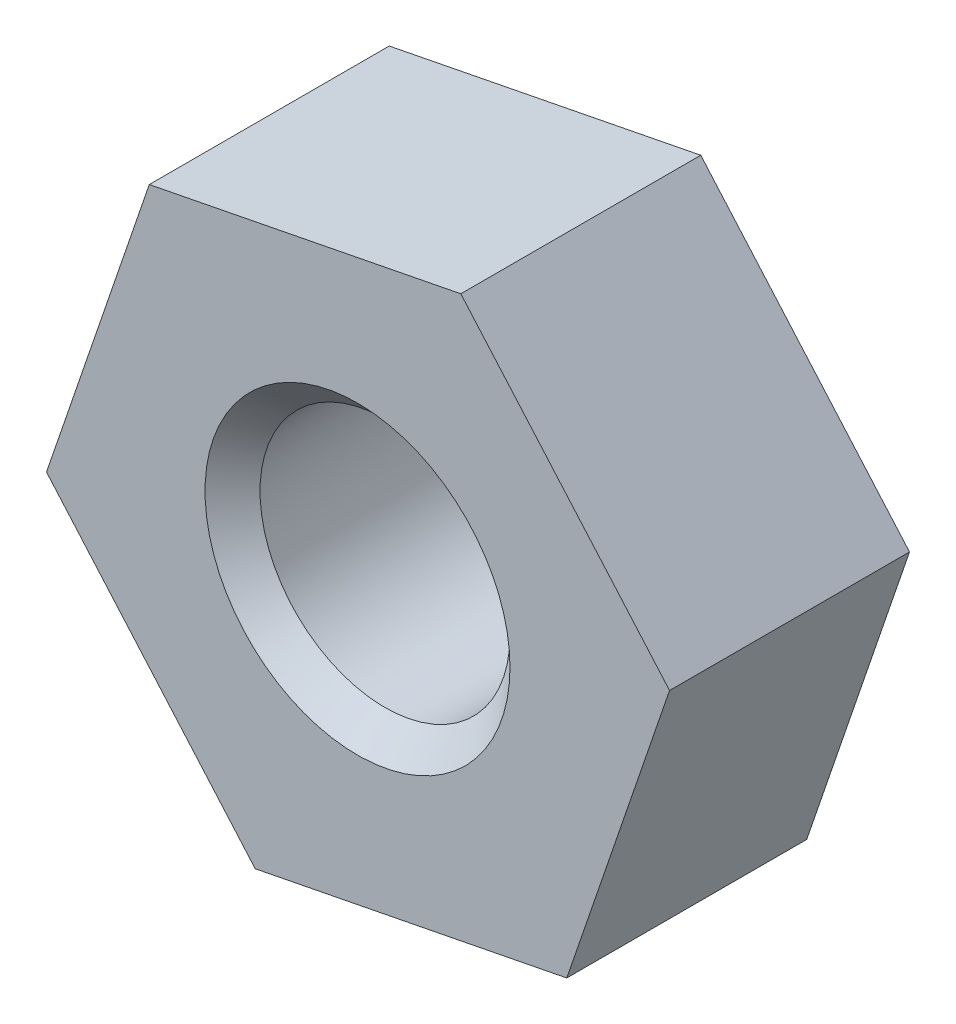
ISO-10303-21;
HEADER;
FILE_DESCRIPTION(('STEP AP214'),'2;1');
FILE_NAME('part.step','',(''),(''),'','','');
FILE_SCHEMA(('AUTOMOTIVE_DESIGN { 1 0 10303 214 1 1 1 1 }'));
ENDSEC;
DATA;
#1=APPLICATION_CONTEXT('core data for automotive mechanical design processes');
#2=APPLICATION_PROTOCOL_DEFINITION('international standard','automotive_design',2000,#1);
#3=PRODUCT_CONTEXT('',#1,'mechanical');
#4=PRODUCT('Part','Part','',(#3));
#5=PRODUCT_RELATED_PRODUCT_CATEGORY('part','',(#4));
#6=PRODUCT_DEFINITION_FORMATION('','',#4);
#7=PRODUCT_DEFINITION_CONTEXT('part definition',#1,'design');
#8=PRODUCT_DEFINITION('design','',#6,#7);
#9=PRODUCT_DEFINITION_SHAPE('','',#8);
#10=(LENGTH_UNIT() NAMED_UNIT(*) SI_UNIT(.MILLI.,.METRE.));
#11=(NAMED_UNIT(*) PLANE_ANGLE_UNIT() SI_UNIT($,.RADIAN.));
#12=(NAMED_UNIT(*) SI_UNIT($,.STERADIAN.) SOLID_ANGLE_UNIT());
#13=UNCERTAINTY_MEASURE_WITH_UNIT(LENGTH_MEASURE(1.E-05),#10,'distance_accuracy_value','');
#14=(GEOMETRIC_REPRESENTATION_CONTEXT(3) GLOBAL_UNCERTAINTY_ASSIGNED_CONTEXT((#13)) GLOBAL_UNIT_ASSIGNED_CONTEXT((#10,
#11,#12)) REPRESENTATION_CONTEXT('',''));
#15=CARTESIAN_POINT('',(0.,0.,0.));
#16=DIRECTION('',(0.,0.,1.));
#17=DIRECTION('',(1.,0.,0.));
#18=AXIS2_PLACEMENT_3D('',#15,#16,#17);
#19=CARTESIAN_POINT('',(-1.02811005333173,-3.00438397206009,2.4));
#20=DIRECTION('',(-0.192674138641678,0.981262796756652,0.));
#21=DIRECTION('',(-0.981262796756653,-0.192674138641678,0.));
#22=AXIS2_PLACEMENT_3D('',#19,#20,#21);
#23=PLANE('',#22);
#24=DIRECTION('',(0.981262796756653,0.192674138641678,0.));
#25=VECTOR('',#24,1.);
#26=CARTESIAN_POINT('',(-1.02811005333173,-3.00438397206009,0.));
#27=LINE('',#26,#25);
#28=CARTESIAN_POINT('',(-1.02811005333173,-3.00438397206009,0.));
#29=VERTEX_POINT('',#28);
#30=CARTESIAN_POINT('',(2.08781781586096,-2.3925614101015,0.));
#31=VERTEX_POINT('',#30);
#32=EDGE_CURVE('E138',#29,#31,#27,.T.);
#33=ORIENTED_EDGE('',*,*,#32,.T.);
#34=DIRECTION('',(0.,0.,-1.));
#35=VECTOR('',#34,1.);
#36=CARTESIAN_POINT('',(2.08781781586096,-2.3925614101015,2.4));
#37=LINE('',#36,#35);
#38=CARTESIAN_POINT('',(2.08781781586096,-2.3925614101015,2.4));
#39=VERTEX_POINT('',#38);
#40=EDGE_CURVE('E11',#39,#31,#37,.T.);
#41=ORIENTED_EDGE('',*,*,#40,.F.);
#42=DIRECTION('',(0.981262796756653,0.192674138641678,0.));
#43=VECTOR('',#42,1.);
#44=CARTESIAN_POINT('',(-1.02811005333173,-3.00438397206009,2.4));
#45=LINE('',#44,#43);
#46=CARTESIAN_POINT('',(-1.02811005333173,-3.00438397206009,2.4));
#47=VERTEX_POINT('',#46);
#48=EDGE_CURVE('E155',#47,#39,#45,.T.);
#49=ORIENTED_EDGE('',*,*,#48,.F.);
#50=DIRECTION('',(0.,0.,-1.));
#51=VECTOR('',#50,1.);
#52=CARTESIAN_POINT('',(-1.02811005333173,-3.00438397206009,2.4));
#53=LINE('',#52,#51);
#54=EDGE_CURVE('E134',#47,#29,#53,.T.);
#55=ORIENTED_EDGE('',*,*,#54,.T.);
#56=EDGE_LOOP('',(#33,#41,#49,#55));
#57=FACE_BOUND('',#56,.T.);
#58=ADVANCED_FACE('F49',(#57),#23,.F.);
#59=CARTESIAN_POINT('',(2.08781781586096,-2.3925614101015,2.4));
#60=DIRECTION('',(-0.946135579100666,0.323770699662348,0.));
#61=DIRECTION('',(-0.323770699662348,-0.946135579100666,0.));
#62=AXIS2_PLACEMENT_3D('',#59,#60,#61);
#63=PLANE('',#62);
#64=DIRECTION('',(0.323770699662348,0.946135579100666,0.));
#65=VECTOR('',#64,1.);
#66=CARTESIAN_POINT('',(2.08781781586096,-2.3925614101015,0.));
#67=LINE('',#66,#65);
#68=CARTESIAN_POINT('',(3.1159278691927,0.611822561958587,0.));
#69=VERTEX_POINT('',#68);
#70=EDGE_CURVE('E142',#31,#69,#67,.T.);
#71=ORIENTED_EDGE('',*,*,#70,.T.);
#72=DIRECTION('',(0.,0.,-1.));
#73=VECTOR('',#72,1.);
#74=CARTESIAN_POINT('',(3.1159278691927,0.611822561958587,2.4));
#75=LINE('',#74,#73);
#76=CARTESIAN_POINT('',(3.1159278691927,0.611822561958587,2.4));
#77=VERTEX_POINT('',#76);
#78=EDGE_CURVE('E58',#77,#69,#75,.T.);
#79=ORIENTED_EDGE('',*,*,#78,.F.);
#80=DIRECTION('',(0.323770699662348,0.946135579100666,0.));
#81=VECTOR('',#80,1.);
#82=CARTESIAN_POINT('',(2.08781781586096,-2.3925614101015,2.4));
#83=LINE('',#82,#81);
#84=EDGE_CURVE('E103',#39,#77,#83,.T.);
#85=ORIENTED_EDGE('',*,*,#84,.F.);
#86=ORIENTED_EDGE('',*,*,#40,.T.);
#87=EDGE_LOOP('',(#71,#79,#85,#86));
#88=FACE_BOUND('',#87,.T.);
#89=ADVANCED_FACE('F184',(#88),#63,.F.);
#90=CARTESIAN_POINT('',(3.1159278691927,0.611822561958587,2.4));
#91=DIRECTION('',(-0.753461440458988,-0.657492097094305,0.));
#92=DIRECTION('',(0.657492097094305,-0.753461440458988,0.));
#93=AXIS2_PLACEMENT_3D('',#90,#91,#92);
#94=PLANE('',#93);
#95=DIRECTION('',(-0.657492097094305,0.753461440458988,0.));
#96=VECTOR('',#95,1.);
#97=CARTESIAN_POINT('',(3.1159278691927,0.611822561958587,0.));
#98=LINE('',#97,#96);
#99=CARTESIAN_POINT('',(1.02811005333174,3.00438397206009,0.));
#100=VERTEX_POINT('',#99);
#101=EDGE_CURVE('E146',#69,#100,#98,.T.);
#102=ORIENTED_EDGE('',*,*,#101,.T.);
#103=DIRECTION('',(0.,0.,-1.));
#104=VECTOR('',#103,1.);
#105=CARTESIAN_POINT('',(1.02811005333174,3.00438397206009,2.4));
#106=LINE('',#105,#104);
#107=CARTESIAN_POINT('',(1.02811005333174,3.00438397206009,2.4));
#108=VERTEX_POINT('',#107);
#109=EDGE_CURVE('E127',#108,#100,#106,.T.);
#110=ORIENTED_EDGE('',*,*,#109,.F.);
#111=DIRECTION('',(-0.657492097094305,0.753461440458988,0.));
#112=VECTOR('',#111,1.);
#113=CARTESIAN_POINT('',(3.1159278691927,0.611822561958587,2.4));
#114=LINE('',#113,#112);
#115=EDGE_CURVE('E116',#77,#108,#114,.T.);
#116=ORIENTED_EDGE('',*,*,#115,.F.);
#117=ORIENTED_EDGE('',*,*,#78,.T.);
#118=EDGE_LOOP('',(#102,#110,#116,#117));
#119=FACE_BOUND('',#118,.T.);
#120=ADVANCED_FACE('F165',(#119),#94,.F.);
#121=CARTESIAN_POINT('',(1.02811005333174,3.00438397206009,2.4));
#122=DIRECTION('',(0.192674138641678,-0.981262796756652,0.));
#123=DIRECTION('',(0.981262796756653,0.192674138641678,0.));
#124=AXIS2_PLACEMENT_3D('',#121,#122,#123);
#125=PLANE('',#124);
#126=DIRECTION('',(-0.981262796756653,-0.192674138641678,0.));
#127=VECTOR('',#126,1.);
#128=CARTESIAN_POINT('',(1.02811005333174,3.00438397206009,0.));
#129=LINE('',#128,#127);
#130=CARTESIAN_POINT('',(-2.08781781586096,2.3925614101015,0.));
#131=VERTEX_POINT('',#130);
#132=EDGE_CURVE('E125',#100,#131,#129,.T.);
#133=ORIENTED_EDGE('',*,*,#132,.T.);
#134=DIRECTION('',(0.,0.,-1.));
#135=VECTOR('',#134,1.);
#136=CARTESIAN_POINT('',(-2.08781781586096,2.3925614101015,2.4));
#137=LINE('',#136,#135);
#138=CARTESIAN_POINT('',(-2.08781781586096,2.3925614101015,2.4));
#139=VERTEX_POINT('',#138);
#140=EDGE_CURVE('E122',#139,#131,#137,.T.);
#141=ORIENTED_EDGE('',*,*,#140,.F.);
#142=DIRECTION('',(-0.981262796756653,-0.192674138641678,0.));
#143=VECTOR('',#142,1.);
#144=CARTESIAN_POINT('',(1.02811005333174,3.00438397206009,2.4));
#145=LINE('',#144,#143);
#146=EDGE_CURVE('E110',#108,#139,#145,.T.);
#147=ORIENTED_EDGE('',*,*,#146,.F.);
#148=ORIENTED_EDGE('',*,*,#109,.T.);
#149=EDGE_LOOP('',(#133,#141,#147,#148));
#150=FACE_BOUND('',#149,.T.);
#151=ADVANCED_FACE('F123',(#150),#125,.F.);
#152=CARTESIAN_POINT('',(-2.08781781586096,2.3925614101015,2.4));
#153=DIRECTION('',(0.946135579100667,-0.323770699662348,0.));
#154=DIRECTION('',(0.323770699662348,0.946135579100667,0.));
#155=AXIS2_PLACEMENT_3D('',#152,#153,#154);
#156=PLANE('',#155);
#157=DIRECTION('',(-0.323770699662348,-0.946135579100666,0.));
#158=VECTOR('',#157,1.);
#159=CARTESIAN_POINT('',(-2.08781781586096,2.3925614101015,0.));
#160=LINE('',#159,#158);
#161=CARTESIAN_POINT('',(-3.1159278691927,-0.611822561958588,0.));
#162=VERTEX_POINT('',#161);
#163=EDGE_CURVE('E89',#131,#162,#160,.T.);
#164=ORIENTED_EDGE('',*,*,#163,.T.);
#165=DIRECTION('',(0.,0.,-1.));
#166=VECTOR('',#165,1.);
#167=CARTESIAN_POINT('',(-3.1159278691927,-0.611822561958588,2.4));
#168=LINE('',#167,#166);
#169=CARTESIAN_POINT('',(-3.1159278691927,-0.611822561958588,2.4));
#170=VERTEX_POINT('',#169);
#171=EDGE_CURVE('E128',#170,#162,#168,.T.);
#172=ORIENTED_EDGE('',*,*,#171,.F.);
#173=DIRECTION('',(-0.323770699662348,-0.946135579100666,0.));
#174=VECTOR('',#173,1.);
#175=CARTESIAN_POINT('',(-2.08781781586096,2.3925614101015,2.4));
#176=LINE('',#175,#174);
#177=EDGE_CURVE('E114',#139,#170,#176,.T.);
#178=ORIENTED_EDGE('',*,*,#177,.F.);
#179=ORIENTED_EDGE('',*,*,#140,.T.);
#180=EDGE_LOOP('',(#164,#172,#178,#179));
#181=FACE_BOUND('',#180,.T.);
#182=ADVANCED_FACE('F130',(#181),#156,.F.);
#183=CARTESIAN_POINT('',(-3.1159278691927,-0.611822561958588,2.4));
#184=DIRECTION('',(0.753461440458988,0.657492097094305,0.));
#185=DIRECTION('',(-0.657492097094305,0.753461440458988,0.));
#186=AXIS2_PLACEMENT_3D('',#183,#184,#185);
#187=PLANE('',#186);
#188=DIRECTION('',(0.657492097094305,-0.753461440458988,0.));
#189=VECTOR('',#188,1.);
#190=CARTESIAN_POINT('',(-3.1159278691927,-0.611822561958588,0.));
#191=LINE('',#190,#189);
#192=EDGE_CURVE('E95',#162,#29,#191,.T.);
#193=ORIENTED_EDGE('',*,*,#192,.T.);
#194=ORIENTED_EDGE('',*,*,#54,.F.);
#195=DIRECTION('',(0.657492097094305,-0.753461440458988,0.));
#196=VECTOR('',#195,1.);
#197=CARTESIAN_POINT('',(-3.1159278691927,-0.611822561958588,2.4));
#198=LINE('',#197,#196);
#199=EDGE_CURVE('E66',#170,#47,#198,.T.);
#200=ORIENTED_EDGE('',*,*,#199,.F.);
#201=ORIENTED_EDGE('',*,*,#171,.T.);
#202=EDGE_LOOP('',(#193,#194,#200,#201));
#203=FACE_BOUND('',#202,.T.);
#204=ADVANCED_FACE('F172',(#203),#187,.F.);
#205=CARTESIAN_POINT('',(0.,0.,2.4));
#206=DIRECTION('',(0.,0.,1.));
#207=DIRECTION('',(1.,0.,0.));
#208=AXIS2_PLACEMENT_3D('',#205,#206,#207);
#209=PLANE('',#208);
#210=CARTESIAN_POINT('',(-0.005030104155474,0.0161290159713307,2.4));
#211=DIRECTION('',(0.,0.,1.));
#212=DIRECTION('',(1.,0.,0.));
#213=AXIS2_PLACEMENT_3D('',#210,#211,#212);
#214=CIRCLE('',#213,1.525);
#215=CARTESIAN_POINT('',(1.51996989584453,0.0161290159713307,2.4));
#216=VERTEX_POINT('',#215);
#217=EDGE_CURVE('E257',#216,#216,#214,.T.);
#218=ORIENTED_EDGE('',*,*,#217,.F.);
#219=EDGE_LOOP('',(#218));
#220=FACE_BOUND('',#219,.T.);
#221=ORIENTED_EDGE('',*,*,#48,.T.);
#222=ORIENTED_EDGE('',*,*,#84,.T.);
#223=ORIENTED_EDGE('',*,*,#115,.T.);
#224=ORIENTED_EDGE('',*,*,#146,.T.);
#225=ORIENTED_EDGE('',*,*,#177,.T.);
#226=ORIENTED_EDGE('',*,*,#199,.T.);
#227=EDGE_LOOP('',(#221,#222,#223,#224,#225,#226));
#228=FACE_BOUND('',#227,.T.);
#229=ADVANCED_FACE('F112',(#220,#228),#209,.T.);
#230=CARTESIAN_POINT('',(0.,0.,0.));
#231=DIRECTION('',(0.,0.,1.));
#232=DIRECTION('',(1.,0.,0.));
#233=AXIS2_PLACEMENT_3D('',#230,#231,#232);
#234=PLANE('',#233);
#235=CARTESIAN_POINT('',(-0.005030104155474,0.0161290159713307,0.));
#236=DIRECTION('',(0.,0.,1.));
#237=DIRECTION('',(1.,0.,0.));
#238=AXIS2_PLACEMENT_3D('',#235,#236,#237);
#239=CIRCLE('',#238,1.25);
#240=CARTESIAN_POINT('',(1.24496989584452,0.0161290159713307,0.));
#241=VERTEX_POINT('',#240);
#242=EDGE_CURVE('E143',#241,#241,#239,.T.);
#243=ORIENTED_EDGE('',*,*,#242,.T.);
#244=EDGE_LOOP('',(#243));
#245=FACE_BOUND('',#244,.T.);
#246=ORIENTED_EDGE('',*,*,#32,.F.);
#247=ORIENTED_EDGE('',*,*,#192,.F.);
#248=ORIENTED_EDGE('',*,*,#163,.F.);
#249=ORIENTED_EDGE('',*,*,#132,.F.);
#250=ORIENTED_EDGE('',*,*,#101,.F.);
#251=ORIENTED_EDGE('',*,*,#70,.F.);
#252=EDGE_LOOP('',(#246,#247,#248,#249,#250,#251));
#253=FACE_BOUND('',#252,.T.);
#254=ADVANCED_FACE('F168',(#245,#253),#234,.F.);
#255=CARTESIAN_POINT('',(-0.005030104155474,0.0161290159713307,2.4));
#256=DIRECTION('',(0.,0.,1.));
#257=DIRECTION('',(1.,0.,0.));
#258=AXIS2_PLACEMENT_3D('',#255,#256,#257);
#259=CYLINDRICAL_SURFACE('',#258,1.24999999999999);
#260=ORIENTED_EDGE('',*,*,#242,.F.);
#261=EDGE_LOOP('',(#260));
#262=FACE_BOUND('',#261,.T.);
#263=CARTESIAN_POINT('',(-0.005030104155474,0.0161290159713307,2.12499999999999));
#264=DIRECTION('',(0.,0.,1.));
#265=DIRECTION('',(1.,0.,0.));
#266=AXIS2_PLACEMENT_3D('',#263,#264,#265);
#267=CIRCLE('',#266,1.24999999999999);
#268=CARTESIAN_POINT('',(1.24496989584451,0.0161290159713307,2.12499999999999));
#269=VERTEX_POINT('',#268);
#270=EDGE_CURVE('E254',#269,#269,#267,.T.);
#271=ORIENTED_EDGE('',*,*,#270,.T.);
#272=EDGE_LOOP('',(#271));
#273=FACE_BOUND('',#272,.T.);
#274=ADVANCED_FACE('F223',(#262,#273),#259,.F.);
#275=CARTESIAN_POINT('',(-0.005030104155474,0.0161290159713307,2.4));
#276=DIRECTION('',(0.,0.,1.));
#277=DIRECTION('',(1.,0.,0.));
#278=AXIS2_PLACEMENT_3D('',#275,#276,#277);
#279=CONICAL_SURFACE('',#278,1.525,0.785398163397448);
#280=ORIENTED_EDGE('',*,*,#270,.F.);
#281=EDGE_LOOP('',(#280));
#282=FACE_BOUND('',#281,.T.);
#283=ORIENTED_EDGE('',*,*,#217,.T.);
#284=EDGE_LOOP('',(#283));
#285=FACE_BOUND('',#284,.T.);
#286=ADVANCED_FACE('F233',(#282,#285),#279,.F.);
#287=CLOSED_SHELL('',(#58,#89,#120,#151,#182,#204,#229,#254,#274,#286));
#288=MANIFOLD_SOLID_BREP('B2',#287);
#289=ADVANCED_BREP_SHAPE_REPRESENTATION('',(#18,#288),#14);
#290=SHAPE_DEFINITION_REPRESENTATION(#9,#289);
ENDSEC;
END-ISO-10303-21;
